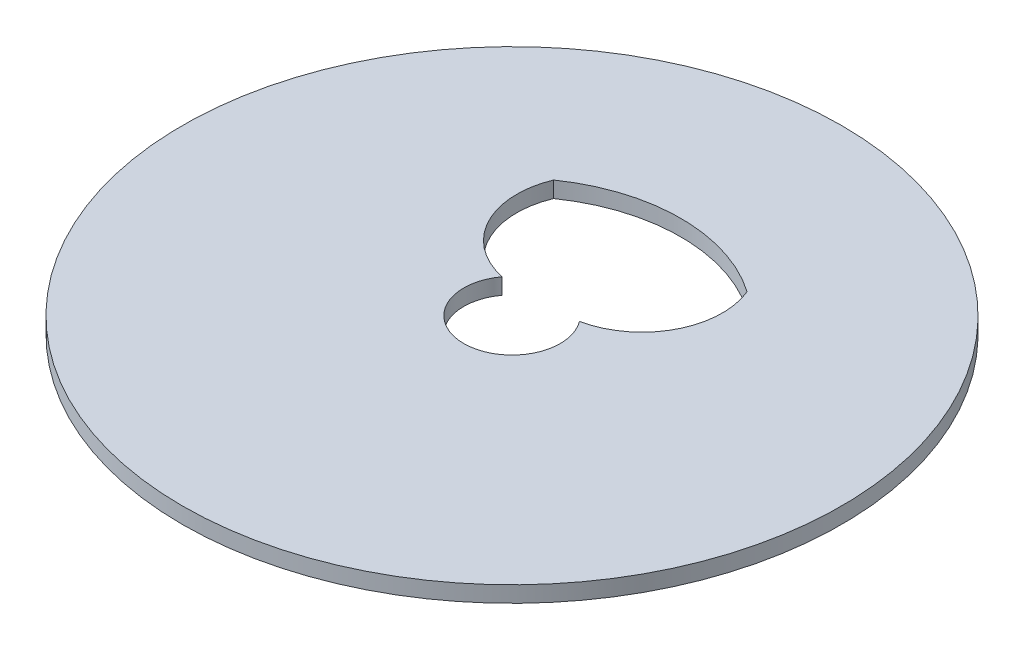
ISO-10303-21;
HEADER;
FILE_DESCRIPTION(('STEP AP214'),'2;1');
FILE_NAME('part.step','',(''),(''),'','','');
FILE_SCHEMA(('AUTOMOTIVE_DESIGN { 1 0 10303 214 1 1 1 1 }'));
ENDSEC;
DATA;
#1=APPLICATION_CONTEXT('core data for automotive mechanical design processes');
#2=APPLICATION_PROTOCOL_DEFINITION('international standard','automotive_design',2000,#1);
#3=PRODUCT_CONTEXT('',#1,'mechanical');
#4=PRODUCT('Part','Part','',(#3));
#5=PRODUCT_RELATED_PRODUCT_CATEGORY('part','',(#4));
#6=PRODUCT_DEFINITION_FORMATION('','',#4);
#7=PRODUCT_DEFINITION_CONTEXT('part definition',#1,'design');
#8=PRODUCT_DEFINITION('design','',#6,#7);
#9=PRODUCT_DEFINITION_SHAPE('','',#8);
#10=(LENGTH_UNIT() NAMED_UNIT(*) SI_UNIT(.MILLI.,.METRE.));
#11=(NAMED_UNIT(*) PLANE_ANGLE_UNIT() SI_UNIT($,.RADIAN.));
#12=(NAMED_UNIT(*) SI_UNIT($,.STERADIAN.) SOLID_ANGLE_UNIT());
#13=UNCERTAINTY_MEASURE_WITH_UNIT(LENGTH_MEASURE(1.E-05),#10,'distance_accuracy_value','');
#14=(GEOMETRIC_REPRESENTATION_CONTEXT(3) GLOBAL_UNCERTAINTY_ASSIGNED_CONTEXT((#13)) GLOBAL_UNIT_ASSIGNED_CONTEXT((#10,
#11,#12)) REPRESENTATION_CONTEXT('',''));
#15=CARTESIAN_POINT('',(0.,0.,0.));
#16=DIRECTION('',(0.,0.,1.));
#17=DIRECTION('',(1.,0.,0.));
#18=AXIS2_PLACEMENT_3D('',#15,#16,#17);
#19=CARTESIAN_POINT('',(0.,2.,0.));
#20=DIRECTION('',(0.,-1.,0.));
#21=DIRECTION('',(0.,0.,-1.));
#22=AXIS2_PLACEMENT_3D('',#19,#20,#21);
#23=CYLINDRICAL_SURFACE('',#22,21.);
#24=CARTESIAN_POINT('',(0.,0.,0.));
#25=DIRECTION('',(0.,1.,0.));
#26=DIRECTION('',(0.,0.,1.));
#27=AXIS2_PLACEMENT_3D('',#24,#25,#26);
#28=CIRCLE('',#27,21.);
#29=CARTESIAN_POINT('',(12.0377375761488,0.,-17.2073494195874));
#30=VERTEX_POINT('',#29);
#31=CARTESIAN_POINT('',(-12.0377375761488,0.,-17.2073494195874));
#32=VERTEX_POINT('',#31);
#33=EDGE_CURVE('E100',#30,#32,#28,.T.);
#34=ORIENTED_EDGE('',*,*,#33,.F.);
#35=DIRECTION('',(0.,-1.,0.));
#36=VECTOR('',#35,1.);
#37=CARTESIAN_POINT('',(12.0377375761488,2.,-17.2073494195874));
#38=LINE('',#37,#36);
#39=CARTESIAN_POINT('',(12.0377375761488,2.,-17.2073494195874));
#40=VERTEX_POINT('',#39);
#41=EDGE_CURVE('E11',#40,#30,#38,.T.);
#42=ORIENTED_EDGE('',*,*,#41,.F.);
#43=CARTESIAN_POINT('',(0.,2.,0.));
#44=DIRECTION('',(0.,1.,0.));
#45=DIRECTION('',(0.,0.,1.));
#46=AXIS2_PLACEMENT_3D('',#43,#44,#45);
#47=CIRCLE('',#46,21.);
#48=CARTESIAN_POINT('',(-12.0377375761488,2.,-17.2073494195874));
#49=VERTEX_POINT('',#48);
#50=EDGE_CURVE('E82',#40,#49,#47,.T.);
#51=ORIENTED_EDGE('',*,*,#50,.T.);
#52=DIRECTION('',(0.,-1.,0.));
#53=VECTOR('',#52,1.);
#54=CARTESIAN_POINT('',(-12.0377375761488,2.,-17.2073494195874));
#55=LINE('',#54,#53);
#56=EDGE_CURVE('E71',#49,#32,#55,.T.);
#57=ORIENTED_EDGE('',*,*,#56,.T.);
#58=EDGE_LOOP('',(#34,#42,#51,#57));
#59=FACE_BOUND('',#58,.T.);
#60=ADVANCED_FACE('F33',(#59),#23,.F.);
#61=CARTESIAN_POINT('',(2.79627853411126,2.,-13.3869522184652));
#62=DIRECTION('',(0.,-1.,0.));
#63=DIRECTION('',(0.,0.,-1.));
#64=AXIS2_PLACEMENT_3D('',#61,#62,#63);
#65=CYLINDRICAL_SURFACE('',#64,10.);
#66=CARTESIAN_POINT('',(2.79627853411126,0.,-13.3869522184652));
#67=DIRECTION('',(0.,1.,0.));
#68=DIRECTION('',(0.,0.,1.));
#69=AXIS2_PLACEMENT_3D('',#66,#67,#68);
#70=CIRCLE('',#69,10.);
#71=CARTESIAN_POINT('',(4.80665012751626,0.,-3.59111605933976));
#72=VERTEX_POINT('',#71);
#73=EDGE_CURVE('E88',#30,#72,#70,.F.);
#74=ORIENTED_EDGE('',*,*,#73,.T.);
#75=DIRECTION('',(0.,-1.,0.));
#76=VECTOR('',#75,1.);
#77=CARTESIAN_POINT('',(4.80665012751626,2.,-3.59111605933976));
#78=LINE('',#77,#76);
#79=CARTESIAN_POINT('',(4.80665012751626,2.,-3.59111605933976));
#80=VERTEX_POINT('',#79);
#81=EDGE_CURVE('E41',#80,#72,#78,.T.);
#82=ORIENTED_EDGE('',*,*,#81,.F.);
#83=CARTESIAN_POINT('',(2.79627853411126,2.,-13.3869522184652));
#84=DIRECTION('',(0.,1.,0.));
#85=DIRECTION('',(0.,0.,1.));
#86=AXIS2_PLACEMENT_3D('',#83,#84,#85);
#87=CIRCLE('',#86,10.);
#88=EDGE_CURVE('E76',#40,#80,#87,.F.);
#89=ORIENTED_EDGE('',*,*,#88,.F.);
#90=ORIENTED_EDGE('',*,*,#41,.T.);
#91=EDGE_LOOP('',(#74,#82,#89,#90));
#92=FACE_BOUND('',#91,.T.);
#93=ADVANCED_FACE('F86',(#92),#65,.F.);
#94=CARTESIAN_POINT('',(0.,2.,0.));
#95=DIRECTION('',(0.,-1.,0.));
#96=DIRECTION('',(0.,0.,-1.));
#97=AXIS2_PLACEMENT_3D('',#94,#95,#96);
#98=CYLINDRICAL_SURFACE('',#97,6.);
#99=CARTESIAN_POINT('',(0.,0.,0.));
#100=DIRECTION('',(0.,1.,0.));
#101=DIRECTION('',(0.,0.,1.));
#102=AXIS2_PLACEMENT_3D('',#99,#100,#101);
#103=CIRCLE('',#102,6.);
#104=CARTESIAN_POINT('',(-4.80665012751626,0.,-3.59111605933977));
#105=VERTEX_POINT('',#104);
#106=EDGE_CURVE('E104',#105,#72,#103,.T.);
#107=ORIENTED_EDGE('',*,*,#106,.F.);
#108=DIRECTION('',(0.,-1.,0.));
#109=VECTOR('',#108,1.);
#110=CARTESIAN_POINT('',(-4.80665012751626,2.,-3.59111605933977));
#111=LINE('',#110,#109);
#112=CARTESIAN_POINT('',(-4.80665012751626,2.,-3.59111605933977));
#113=VERTEX_POINT('',#112);
#114=EDGE_CURVE('E64',#113,#105,#111,.T.);
#115=ORIENTED_EDGE('',*,*,#114,.F.);
#116=CARTESIAN_POINT('',(0.,2.,0.));
#117=DIRECTION('',(0.,1.,0.));
#118=DIRECTION('',(0.,0.,1.));
#119=AXIS2_PLACEMENT_3D('',#116,#117,#118);
#120=CIRCLE('',#119,6.);
#121=EDGE_CURVE('E81',#113,#80,#120,.T.);
#122=ORIENTED_EDGE('',*,*,#121,.T.);
#123=ORIENTED_EDGE('',*,*,#81,.T.);
#124=EDGE_LOOP('',(#107,#115,#122,#123));
#125=FACE_BOUND('',#124,.T.);
#126=ADVANCED_FACE('F92',(#125),#98,.F.);
#127=CARTESIAN_POINT('',(-2.79627853411125,2.,-13.3869522184652));
#128=DIRECTION('',(0.,-1.,0.));
#129=DIRECTION('',(0.,0.,-1.));
#130=AXIS2_PLACEMENT_3D('',#127,#128,#129);
#131=CYLINDRICAL_SURFACE('',#130,10.);
#132=CARTESIAN_POINT('',(-2.79627853411125,0.,-13.3869522184652));
#133=DIRECTION('',(0.,1.,0.));
#134=DIRECTION('',(0.,0.,1.));
#135=AXIS2_PLACEMENT_3D('',#132,#133,#134);
#136=CIRCLE('',#135,10.);
#137=EDGE_CURVE('E106',#105,#32,#136,.F.);
#138=ORIENTED_EDGE('',*,*,#137,.T.);
#139=ORIENTED_EDGE('',*,*,#56,.F.);
#140=CARTESIAN_POINT('',(-2.79627853411125,2.,-13.3869522184652));
#141=DIRECTION('',(0.,1.,0.));
#142=DIRECTION('',(0.,0.,1.));
#143=AXIS2_PLACEMENT_3D('',#140,#141,#142);
#144=CIRCLE('',#143,10.);
#145=EDGE_CURVE('E49',#113,#49,#144,.F.);
#146=ORIENTED_EDGE('',*,*,#145,.F.);
#147=ORIENTED_EDGE('',*,*,#114,.T.);
#148=EDGE_LOOP('',(#138,#139,#146,#147));
#149=FACE_BOUND('',#148,.T.);
#150=ADVANCED_FACE('F121',(#149),#131,.F.);
#151=CARTESIAN_POINT('',(0.,2.,0.));
#152=DIRECTION('',(0.,-1.,0.));
#153=DIRECTION('',(0.,0.,-1.));
#154=AXIS2_PLACEMENT_3D('',#151,#152,#153);
#155=CYLINDRICAL_SURFACE('',#154,41.);
#156=CARTESIAN_POINT('',(0.,2.,0.));
#157=DIRECTION('',(0.,1.,0.));
#158=DIRECTION('',(0.,0.,1.));
#159=AXIS2_PLACEMENT_3D('',#156,#157,#158);
#160=CIRCLE('',#159,41.);
#161=CARTESIAN_POINT('',(0.,2.,41.));
#162=VERTEX_POINT('',#161);
#163=EDGE_CURVE('E94',#162,#162,#160,.T.);
#164=ORIENTED_EDGE('',*,*,#163,.F.);
#165=EDGE_LOOP('',(#164));
#166=FACE_BOUND('',#165,.T.);
#167=CARTESIAN_POINT('',(0.,0.,0.));
#168=DIRECTION('',(0.,1.,0.));
#169=DIRECTION('',(0.,0.,1.));
#170=AXIS2_PLACEMENT_3D('',#167,#168,#169);
#171=CIRCLE('',#170,41.);
#172=CARTESIAN_POINT('',(0.,0.,41.));
#173=VERTEX_POINT('',#172);
#174=EDGE_CURVE('E108',#173,#173,#171,.T.);
#175=ORIENTED_EDGE('',*,*,#174,.T.);
#176=EDGE_LOOP('',(#175));
#177=FACE_BOUND('',#176,.T.);
#178=ADVANCED_FACE('F126',(#166,#177),#155,.T.);
#179=CARTESIAN_POINT('',(0.,2.,0.));
#180=DIRECTION('',(0.,1.,0.));
#181=DIRECTION('',(0.,0.,1.));
#182=AXIS2_PLACEMENT_3D('',#179,#180,#181);
#183=PLANE('',#182);
#184=ORIENTED_EDGE('',*,*,#50,.F.);
#185=ORIENTED_EDGE('',*,*,#88,.T.);
#186=ORIENTED_EDGE('',*,*,#121,.F.);
#187=ORIENTED_EDGE('',*,*,#145,.T.);
#188=EDGE_LOOP('',(#184,#185,#186,#187));
#189=FACE_BOUND('',#188,.T.);
#190=ORIENTED_EDGE('',*,*,#163,.T.);
#191=EDGE_LOOP('',(#190));
#192=FACE_BOUND('',#191,.T.);
#193=ADVANCED_FACE('F78',(#189,#192),#183,.T.);
#194=CARTESIAN_POINT('',(0.,0.,0.));
#195=DIRECTION('',(0.,1.,0.));
#196=DIRECTION('',(0.,0.,1.));
#197=AXIS2_PLACEMENT_3D('',#194,#195,#196);
#198=PLANE('',#197);
#199=ORIENTED_EDGE('',*,*,#33,.T.);
#200=ORIENTED_EDGE('',*,*,#137,.F.);
#201=ORIENTED_EDGE('',*,*,#106,.T.);
#202=ORIENTED_EDGE('',*,*,#73,.F.);
#203=EDGE_LOOP('',(#199,#200,#201,#202));
#204=FACE_BOUND('',#203,.T.);
#205=ORIENTED_EDGE('',*,*,#174,.F.);
#206=EDGE_LOOP('',(#205));
#207=FACE_BOUND('',#206,.T.);
#208=ADVANCED_FACE('F130',(#204,#207),#198,.F.);
#209=CLOSED_SHELL('',(#60,#93,#126,#150,#178,#193,#208));
#210=MANIFOLD_SOLID_BREP('B2',#209);
#211=ADVANCED_BREP_SHAPE_REPRESENTATION('',(#18,#210),#14);
#212=SHAPE_DEFINITION_REPRESENTATION(#9,#211);
ENDSEC;
END-ISO-10303-21;
